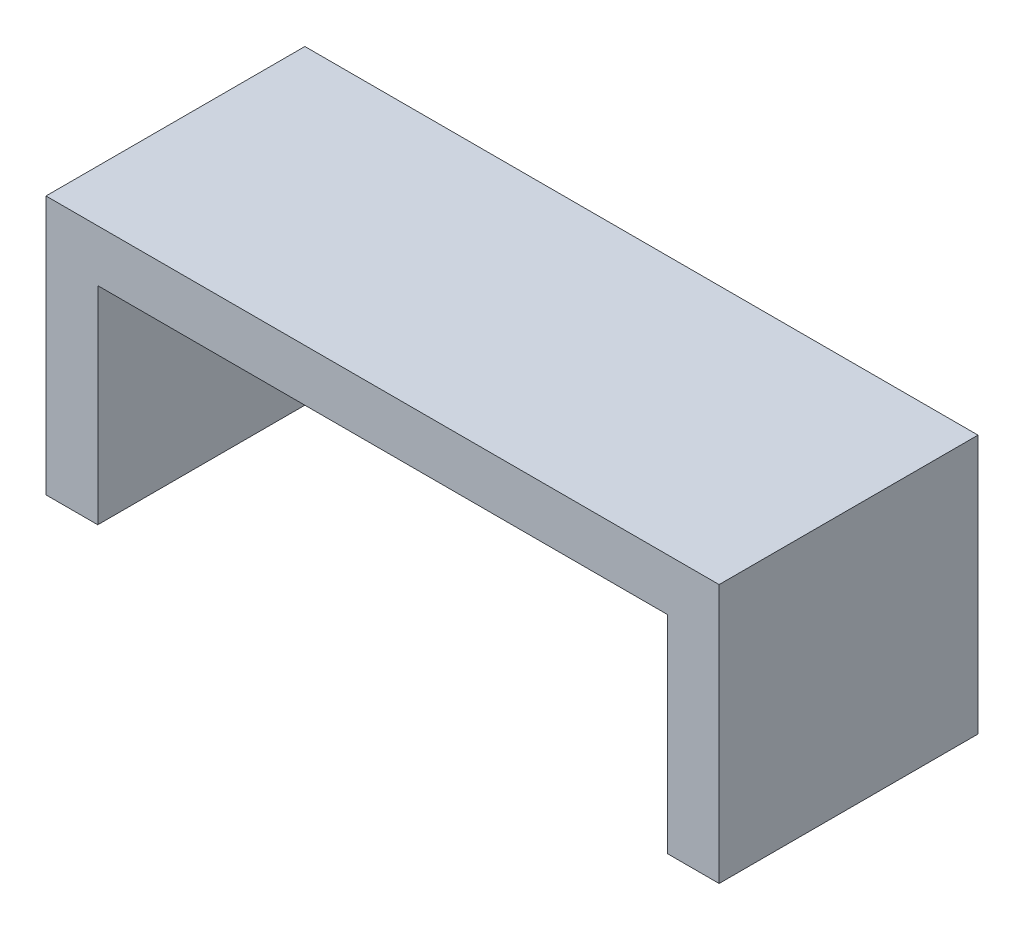
ISO-10303-21;
HEADER;
FILE_DESCRIPTION(('STEP AP214'),'2;1');
FILE_NAME('part.step','',(''),(''),'','','');
FILE_SCHEMA(('AUTOMOTIVE_DESIGN { 1 0 10303 214 1 1 1 1 }'));
ENDSEC;
DATA;
#1=APPLICATION_CONTEXT('core data for automotive mechanical design processes');
#2=APPLICATION_PROTOCOL_DEFINITION('international standard','automotive_design',2000,#1);
#3=PRODUCT_CONTEXT('',#1,'mechanical');
#4=PRODUCT('Part','Part','',(#3));
#5=PRODUCT_RELATED_PRODUCT_CATEGORY('part','',(#4));
#6=PRODUCT_DEFINITION_FORMATION('','',#4);
#7=PRODUCT_DEFINITION_CONTEXT('part definition',#1,'design');
#8=PRODUCT_DEFINITION('design','',#6,#7);
#9=PRODUCT_DEFINITION_SHAPE('','',#8);
#10=(LENGTH_UNIT() NAMED_UNIT(*) SI_UNIT(.MILLI.,.METRE.));
#11=(NAMED_UNIT(*) PLANE_ANGLE_UNIT() SI_UNIT($,.RADIAN.));
#12=(NAMED_UNIT(*) SI_UNIT($,.STERADIAN.) SOLID_ANGLE_UNIT());
#13=UNCERTAINTY_MEASURE_WITH_UNIT(LENGTH_MEASURE(1.E-05),#10,'distance_accuracy_value','');
#14=(GEOMETRIC_REPRESENTATION_CONTEXT(3) GLOBAL_UNCERTAINTY_ASSIGNED_CONTEXT((#13)) GLOBAL_UNIT_ASSIGNED_CONTEXT((#10,
#11,#12)) REPRESENTATION_CONTEXT('',''));
#15=CARTESIAN_POINT('',(0.,0.,0.));
#16=DIRECTION('',(0.,0.,1.));
#17=DIRECTION('',(1.,0.,0.));
#18=AXIS2_PLACEMENT_3D('',#15,#16,#17);
#19=CARTESIAN_POINT('',(0.,20.,0.));
#20=DIRECTION('',(0.,1.,0.));
#21=DIRECTION('',(0.,0.,1.));
#22=AXIS2_PLACEMENT_3D('',#19,#20,#21);
#23=PLANE('',#22);
#24=DIRECTION('',(0.,0.,1.));
#25=VECTOR('',#24,1.);
#26=CARTESIAN_POINT('',(27.5,20.,-12.5));
#27=LINE('',#26,#25);
#28=CARTESIAN_POINT('',(27.5,20.,-12.5));
#29=VERTEX_POINT('',#28);
#30=CARTESIAN_POINT('',(27.5,20.,12.5));
#31=VERTEX_POINT('',#30);
#32=EDGE_CURVE('E104',#29,#31,#27,.T.);
#33=ORIENTED_EDGE('',*,*,#32,.T.);
#34=DIRECTION('',(1.,0.,0.));
#35=VECTOR('',#34,1.);
#36=CARTESIAN_POINT('',(-32.5,20.,12.5));
#37=LINE('',#36,#35);
#38=CARTESIAN_POINT('',(-27.5,20.,12.5));
#39=VERTEX_POINT('',#38);
#40=EDGE_CURVE('E101',#39,#31,#37,.T.);
#41=ORIENTED_EDGE('',*,*,#40,.F.);
#42=DIRECTION('',(0.,0.,-1.));
#43=VECTOR('',#42,1.);
#44=CARTESIAN_POINT('',(-27.5,20.,-12.5));
#45=LINE('',#44,#43);
#46=CARTESIAN_POINT('',(-27.5,20.,-12.5));
#47=VERTEX_POINT('',#46);
#48=EDGE_CURVE('E89',#39,#47,#45,.T.);
#49=ORIENTED_EDGE('',*,*,#48,.T.);
#50=DIRECTION('',(-1.,0.,0.));
#51=VECTOR('',#50,1.);
#52=CARTESIAN_POINT('',(-32.5,20.,-12.5));
#53=LINE('',#52,#51);
#54=EDGE_CURVE('E106',#29,#47,#53,.T.);
#55=ORIENTED_EDGE('',*,*,#54,.F.);
#56=EDGE_LOOP('',(#33,#41,#49,#55));
#57=FACE_BOUND('',#56,.T.);
#58=ADVANCED_FACE('F33',(#57),#23,.F.);
#59=CARTESIAN_POINT('',(-27.5,20.,-12.5));
#60=DIRECTION('',(-1.,0.,0.));
#61=DIRECTION('',(0.,0.,1.));
#62=AXIS2_PLACEMENT_3D('',#59,#60,#61);
#63=PLANE('',#62);
#64=DIRECTION('',(0.,0.,-1.));
#65=VECTOR('',#64,1.);
#66=CARTESIAN_POINT('',(-27.5,0.,-12.5));
#67=LINE('',#66,#65);
#68=CARTESIAN_POINT('',(-27.5,0.,12.5));
#69=VERTEX_POINT('',#68);
#70=CARTESIAN_POINT('',(-27.5,0.,-12.5));
#71=VERTEX_POINT('',#70);
#72=EDGE_CURVE('E88',#69,#71,#67,.T.);
#73=ORIENTED_EDGE('',*,*,#72,.T.);
#74=DIRECTION('',(0.,-1.,0.));
#75=VECTOR('',#74,1.);
#76=CARTESIAN_POINT('',(-27.5,20.,-12.5));
#77=LINE('',#76,#75);
#78=EDGE_CURVE('E11',#47,#71,#77,.T.);
#79=ORIENTED_EDGE('',*,*,#78,.F.);
#80=ORIENTED_EDGE('',*,*,#48,.F.);
#81=DIRECTION('',(0.,-1.,0.));
#82=VECTOR('',#81,1.);
#83=CARTESIAN_POINT('',(-27.5,20.,12.5));
#84=LINE('',#83,#82);
#85=EDGE_CURVE('E49',#39,#69,#84,.T.);
#86=ORIENTED_EDGE('',*,*,#85,.T.);
#87=EDGE_LOOP('',(#73,#79,#80,#86));
#88=FACE_BOUND('',#87,.T.);
#89=ADVANCED_FACE('F35',(#88),#63,.F.);
#90=CARTESIAN_POINT('',(-32.5,20.,-12.5));
#91=DIRECTION('',(0.,0.,1.));
#92=DIRECTION('',(1.,0.,0.));
#93=AXIS2_PLACEMENT_3D('',#90,#91,#92);
#94=PLANE('',#93);
#95=DIRECTION('',(-1.,0.,0.));
#96=VECTOR('',#95,1.);
#97=CARTESIAN_POINT('',(-32.5,0.,-12.5));
#98=LINE('',#97,#96);
#99=CARTESIAN_POINT('',(-32.5,0.,-12.5));
#100=VERTEX_POINT('',#99);
#101=EDGE_CURVE('E77',#71,#100,#98,.T.);
#102=ORIENTED_EDGE('',*,*,#101,.T.);
#103=DIRECTION('',(0.,-1.,0.));
#104=VECTOR('',#103,1.);
#105=CARTESIAN_POINT('',(-32.5,20.,-12.5));
#106=LINE('',#105,#104);
#107=CARTESIAN_POINT('',(-32.5,25.,-12.5));
#108=VERTEX_POINT('',#107);
#109=EDGE_CURVE('E42',#108,#100,#106,.T.);
#110=ORIENTED_EDGE('',*,*,#109,.F.);
#111=DIRECTION('',(-1.,0.,0.));
#112=VECTOR('',#111,1.);
#113=CARTESIAN_POINT('',(-32.5,25.,-12.5));
#114=LINE('',#113,#112);
#115=CARTESIAN_POINT('',(32.5,25.,-12.5));
#116=VERTEX_POINT('',#115);
#117=EDGE_CURVE('E116',#116,#108,#114,.T.);
#118=ORIENTED_EDGE('',*,*,#117,.F.);
#119=DIRECTION('',(0.,-1.,0.));
#120=VECTOR('',#119,1.);
#121=CARTESIAN_POINT('',(32.5,25.,-12.5));
#122=LINE('',#121,#120);
#123=CARTESIAN_POINT('',(32.5,0.,-12.5));
#124=VERTEX_POINT('',#123);
#125=EDGE_CURVE('E119',#116,#124,#122,.T.);
#126=ORIENTED_EDGE('',*,*,#125,.T.);
#127=DIRECTION('',(-1.,0.,0.));
#128=VECTOR('',#127,1.);
#129=CARTESIAN_POINT('',(32.5,0.,-12.5));
#130=LINE('',#129,#128);
#131=CARTESIAN_POINT('',(27.5,0.,-12.5));
#132=VERTEX_POINT('',#131);
#133=EDGE_CURVE('E164',#124,#132,#130,.T.);
#134=ORIENTED_EDGE('',*,*,#133,.T.);
#135=DIRECTION('',(0.,-1.,0.));
#136=VECTOR('',#135,1.);
#137=CARTESIAN_POINT('',(27.5,20.,-12.5));
#138=LINE('',#137,#136);
#139=EDGE_CURVE('E107',#29,#132,#138,.T.);
#140=ORIENTED_EDGE('',*,*,#139,.F.);
#141=ORIENTED_EDGE('',*,*,#54,.T.);
#142=ORIENTED_EDGE('',*,*,#78,.T.);
#143=EDGE_LOOP('',(#102,#110,#118,#126,#134,#140,#141,#142));
#144=FACE_BOUND('',#143,.T.);
#145=ADVANCED_FACE('F126',(#144),#94,.F.);
#146=CARTESIAN_POINT('',(-32.5,20.,-12.5));
#147=DIRECTION('',(1.,0.,0.));
#148=DIRECTION('',(0.,0.,-1.));
#149=AXIS2_PLACEMENT_3D('',#146,#147,#148);
#150=PLANE('',#149);
#151=DIRECTION('',(0.,0.,1.));
#152=VECTOR('',#151,1.);
#153=CARTESIAN_POINT('',(-32.5,0.,-12.5));
#154=LINE('',#153,#152);
#155=CARTESIAN_POINT('',(-32.5,0.,12.5));
#156=VERTEX_POINT('',#155);
#157=EDGE_CURVE('E66',#100,#156,#154,.T.);
#158=ORIENTED_EDGE('',*,*,#157,.T.);
#159=DIRECTION('',(0.,-1.,0.));
#160=VECTOR('',#159,1.);
#161=CARTESIAN_POINT('',(-32.5,20.,12.5));
#162=LINE('',#161,#160);
#163=CARTESIAN_POINT('',(-32.5,25.,12.5));
#164=VERTEX_POINT('',#163);
#165=EDGE_CURVE('E71',#164,#156,#162,.T.);
#166=ORIENTED_EDGE('',*,*,#165,.F.);
#167=DIRECTION('',(0.,0.,1.));
#168=VECTOR('',#167,1.);
#169=CARTESIAN_POINT('',(-32.5,25.,-12.5));
#170=LINE('',#169,#168);
#171=EDGE_CURVE('E110',#108,#164,#170,.T.);
#172=ORIENTED_EDGE('',*,*,#171,.F.);
#173=ORIENTED_EDGE('',*,*,#109,.T.);
#174=EDGE_LOOP('',(#158,#166,#172,#173));
#175=FACE_BOUND('',#174,.T.);
#176=ADVANCED_FACE('F68',(#175),#150,.F.);
#177=CARTESIAN_POINT('',(-32.5,20.,12.5));
#178=DIRECTION('',(0.,0.,-1.));
#179=DIRECTION('',(-1.,0.,0.));
#180=AXIS2_PLACEMENT_3D('',#177,#178,#179);
#181=PLANE('',#180);
#182=DIRECTION('',(1.,0.,0.));
#183=VECTOR('',#182,1.);
#184=CARTESIAN_POINT('',(-32.5,0.,12.5));
#185=LINE('',#184,#183);
#186=EDGE_CURVE('E76',#156,#69,#185,.T.);
#187=ORIENTED_EDGE('',*,*,#186,.T.);
#188=ORIENTED_EDGE('',*,*,#85,.F.);
#189=ORIENTED_EDGE('',*,*,#40,.T.);
#190=DIRECTION('',(0.,-1.,0.));
#191=VECTOR('',#190,1.);
#192=CARTESIAN_POINT('',(27.5,20.,12.5));
#193=LINE('',#192,#191);
#194=CARTESIAN_POINT('',(27.5,0.,12.5));
#195=VERTEX_POINT('',#194);
#196=EDGE_CURVE('E113',#31,#195,#193,.T.);
#197=ORIENTED_EDGE('',*,*,#196,.T.);
#198=DIRECTION('',(1.,0.,0.));
#199=VECTOR('',#198,1.);
#200=CARTESIAN_POINT('',(32.5,0.,12.5));
#201=LINE('',#200,#199);
#202=CARTESIAN_POINT('',(32.5,0.,12.5));
#203=VERTEX_POINT('',#202);
#204=EDGE_CURVE('E168',#195,#203,#201,.T.);
#205=ORIENTED_EDGE('',*,*,#204,.T.);
#206=DIRECTION('',(0.,-1.,0.));
#207=VECTOR('',#206,1.);
#208=CARTESIAN_POINT('',(32.5,25.,12.5));
#209=LINE('',#208,#207);
#210=CARTESIAN_POINT('',(32.5,25.,12.5));
#211=VERTEX_POINT('',#210);
#212=EDGE_CURVE('E122',#211,#203,#209,.T.);
#213=ORIENTED_EDGE('',*,*,#212,.F.);
#214=DIRECTION('',(1.,0.,0.));
#215=VECTOR('',#214,1.);
#216=CARTESIAN_POINT('',(-32.5,25.,12.5));
#217=LINE('',#216,#215);
#218=EDGE_CURVE('E82',#164,#211,#217,.T.);
#219=ORIENTED_EDGE('',*,*,#218,.F.);
#220=ORIENTED_EDGE('',*,*,#165,.T.);
#221=EDGE_LOOP('',(#187,#188,#189,#197,#205,#213,#219,#220));
#222=FACE_BOUND('',#221,.T.);
#223=ADVANCED_FACE('F79',(#222),#181,.F.);
#224=CARTESIAN_POINT('',(0.,0.,0.));
#225=DIRECTION('',(0.,1.,0.));
#226=DIRECTION('',(0.,0.,1.));
#227=AXIS2_PLACEMENT_3D('',#224,#225,#226);
#228=PLANE('',#227);
#229=ORIENTED_EDGE('',*,*,#72,.F.);
#230=ORIENTED_EDGE('',*,*,#186,.F.);
#231=ORIENTED_EDGE('',*,*,#157,.F.);
#232=ORIENTED_EDGE('',*,*,#101,.F.);
#233=EDGE_LOOP('',(#229,#230,#231,#232));
#234=FACE_BOUND('',#233,.T.);
#235=ADVANCED_FACE('F86',(#234),#228,.F.);
#236=CARTESIAN_POINT('',(32.5,25.,-12.5));
#237=DIRECTION('',(-1.,0.,0.));
#238=DIRECTION('',(0.,0.,1.));
#239=AXIS2_PLACEMENT_3D('',#236,#237,#238);
#240=PLANE('',#239);
#241=ORIENTED_EDGE('',*,*,#212,.T.);
#242=DIRECTION('',(0.,0.,-1.));
#243=VECTOR('',#242,1.);
#244=CARTESIAN_POINT('',(32.5,0.,-12.5));
#245=LINE('',#244,#243);
#246=EDGE_CURVE('E162',#203,#124,#245,.T.);
#247=ORIENTED_EDGE('',*,*,#246,.T.);
#248=ORIENTED_EDGE('',*,*,#125,.F.);
#249=DIRECTION('',(0.,0.,-1.));
#250=VECTOR('',#249,1.);
#251=CARTESIAN_POINT('',(32.5,25.,-12.5));
#252=LINE('',#251,#250);
#253=EDGE_CURVE('E155',#211,#116,#252,.T.);
#254=ORIENTED_EDGE('',*,*,#253,.F.);
#255=EDGE_LOOP('',(#241,#247,#248,#254));
#256=FACE_BOUND('',#255,.T.);
#257=ADVANCED_FACE('F160',(#256),#240,.F.);
#258=CARTESIAN_POINT('',(0.,25.,0.));
#259=DIRECTION('',(0.,1.,0.));
#260=DIRECTION('',(0.,0.,1.));
#261=AXIS2_PLACEMENT_3D('',#258,#259,#260);
#262=PLANE('',#261);
#263=ORIENTED_EDGE('',*,*,#171,.T.);
#264=ORIENTED_EDGE('',*,*,#218,.T.);
#265=ORIENTED_EDGE('',*,*,#253,.T.);
#266=ORIENTED_EDGE('',*,*,#117,.T.);
#267=EDGE_LOOP('',(#263,#264,#265,#266));
#268=FACE_BOUND('',#267,.T.);
#269=ADVANCED_FACE('F157',(#268),#262,.T.);
#270=CARTESIAN_POINT('',(27.5,20.,-12.5));
#271=DIRECTION('',(1.,0.,0.));
#272=DIRECTION('',(0.,0.,-1.));
#273=AXIS2_PLACEMENT_3D('',#270,#271,#272);
#274=PLANE('',#273);
#275=DIRECTION('',(0.,0.,1.));
#276=VECTOR('',#275,1.);
#277=CARTESIAN_POINT('',(27.5,0.,-12.5));
#278=LINE('',#277,#276);
#279=EDGE_CURVE('E166',#132,#195,#278,.T.);
#280=ORIENTED_EDGE('',*,*,#279,.T.);
#281=ORIENTED_EDGE('',*,*,#196,.F.);
#282=ORIENTED_EDGE('',*,*,#32,.F.);
#283=ORIENTED_EDGE('',*,*,#139,.T.);
#284=EDGE_LOOP('',(#280,#281,#282,#283));
#285=FACE_BOUND('',#284,.T.);
#286=ADVANCED_FACE('F179',(#285),#274,.F.);
#287=CARTESIAN_POINT('',(0.,0.,0.));
#288=DIRECTION('',(0.,1.,0.));
#289=DIRECTION('',(0.,0.,1.));
#290=AXIS2_PLACEMENT_3D('',#287,#288,#289);
#291=PLANE('',#290);
#292=ORIENTED_EDGE('',*,*,#133,.F.);
#293=ORIENTED_EDGE('',*,*,#246,.F.);
#294=ORIENTED_EDGE('',*,*,#204,.F.);
#295=ORIENTED_EDGE('',*,*,#279,.F.);
#296=EDGE_LOOP('',(#292,#293,#294,#295));
#297=FACE_BOUND('',#296,.T.);
#298=ADVANCED_FACE('F178',(#297),#291,.F.);
#299=CLOSED_SHELL('',(#58,#89,#145,#176,#223,#235,#257,#269,#286,#298));
#300=MANIFOLD_SOLID_BREP('B2',#299);
#301=ADVANCED_BREP_SHAPE_REPRESENTATION('',(#18,#300),#14);
#302=SHAPE_DEFINITION_REPRESENTATION(#9,#301);
ENDSEC;
END-ISO-10303-21;
